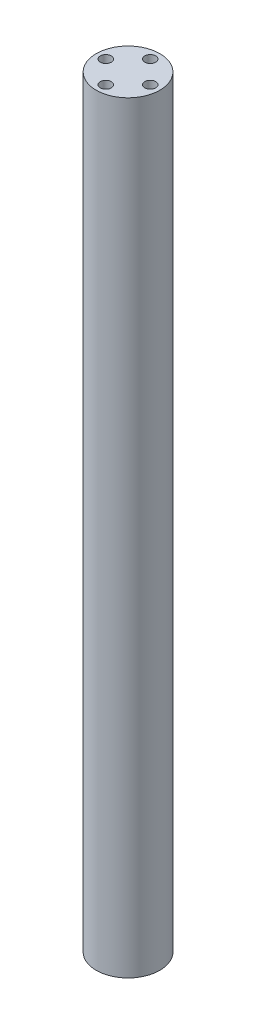
ISO-10303-21;
HEADER;
FILE_DESCRIPTION(('STEP AP214'),'2;1');
FILE_NAME('part.step','',(''),(''),'','','');
FILE_SCHEMA(('AUTOMOTIVE_DESIGN { 1 0 10303 214 1 1 1 1 }'));
ENDSEC;
DATA;
#1=APPLICATION_CONTEXT('core data for automotive mechanical design processes');
#2=APPLICATION_PROTOCOL_DEFINITION('international standard','automotive_design',2000,#1);
#3=PRODUCT_CONTEXT('',#1,'mechanical');
#4=PRODUCT('Part','Part','',(#3));
#5=PRODUCT_RELATED_PRODUCT_CATEGORY('part','',(#4));
#6=PRODUCT_DEFINITION_FORMATION('','',#4);
#7=PRODUCT_DEFINITION_CONTEXT('part definition',#1,'design');
#8=PRODUCT_DEFINITION('design','',#6,#7);
#9=PRODUCT_DEFINITION_SHAPE('','',#8);
#10=(LENGTH_UNIT() NAMED_UNIT(*) SI_UNIT(.MILLI.,.METRE.));
#11=(NAMED_UNIT(*) PLANE_ANGLE_UNIT() SI_UNIT($,.RADIAN.));
#12=(NAMED_UNIT(*) SI_UNIT($,.STERADIAN.) SOLID_ANGLE_UNIT());
#13=UNCERTAINTY_MEASURE_WITH_UNIT(LENGTH_MEASURE(1.E-05),#10,'distance_accuracy_value','');
#14=(GEOMETRIC_REPRESENTATION_CONTEXT(3) GLOBAL_UNCERTAINTY_ASSIGNED_CONTEXT((#13)) GLOBAL_UNIT_ASSIGNED_CONTEXT((#10,
#11,#12)) REPRESENTATION_CONTEXT('',''));
#15=CARTESIAN_POINT('',(0.,0.,0.));
#16=DIRECTION('',(0.,0.,1.));
#17=DIRECTION('',(1.,0.,0.));
#18=AXIS2_PLACEMENT_3D('',#15,#16,#17);
#19=CARTESIAN_POINT('',(0.,304.8,0.));
#20=DIRECTION('',(0.,-1.,0.));
#21=DIRECTION('',(0.,0.,-1.));
#22=AXIS2_PLACEMENT_3D('',#19,#20,#21);
#23=CYLINDRICAL_SURFACE('',#22,12.7);
#24=CARTESIAN_POINT('',(0.,304.8,0.));
#25=DIRECTION('',(0.,1.,0.));
#26=DIRECTION('',(0.,0.,1.));
#27=AXIS2_PLACEMENT_3D('',#24,#25,#26);
#28=CIRCLE('',#27,12.7);
#29=CARTESIAN_POINT('',(0.,304.8,-12.7));
#30=VERTEX_POINT('',#29);
#31=EDGE_CURVE('E10',#30,#30,#28,.T.);
#32=CARTESIAN_POINT('',(0.,0.,0.));
#33=DIRECTION('',(0.,1.,0.));
#34=DIRECTION('',(0.,0.,1.));
#35=AXIS2_PLACEMENT_3D('',#32,#33,#34);
#36=CIRCLE('',#35,12.7);
#37=CARTESIAN_POINT('',(0.,0.,-12.7));
#38=VERTEX_POINT('',#37);
#39=EDGE_CURVE('E40',#38,#38,#36,.T.);
#40=CARTESIAN_POINT('',(0.,304.8,-12.7));
#41=CARTESIAN_POINT('',(0.,301.625,-12.7));
#42=CARTESIAN_POINT('',(0.,298.45,-12.7));
#43=CARTESIAN_POINT('',(0.,292.1,-12.7));
#44=CARTESIAN_POINT('',(0.,288.925,-12.7));
#45=CARTESIAN_POINT('',(0.,282.575,-12.7));
#46=CARTESIAN_POINT('',(0.,279.4,-12.7));
#47=CARTESIAN_POINT('',(0.,273.05,-12.7));
#48=CARTESIAN_POINT('',(0.,269.875,-12.7));
#49=CARTESIAN_POINT('',(0.,263.525,-12.7));
#50=CARTESIAN_POINT('',(0.,260.35,-12.7));
#51=CARTESIAN_POINT('',(0.,254.,-12.7));
#52=CARTESIAN_POINT('',(0.,250.825,-12.7));
#53=CARTESIAN_POINT('',(0.,244.475,-12.7));
#54=CARTESIAN_POINT('',(0.,241.3,-12.7));
#55=CARTESIAN_POINT('',(0.,234.95,-12.7));
#56=CARTESIAN_POINT('',(0.,231.775,-12.7));
#57=CARTESIAN_POINT('',(0.,225.425,-12.7));
#58=CARTESIAN_POINT('',(0.,222.25,-12.7));
#59=CARTESIAN_POINT('',(0.,215.9,-12.7));
#60=CARTESIAN_POINT('',(0.,212.725,-12.7));
#61=CARTESIAN_POINT('',(0.,206.375,-12.7));
#62=CARTESIAN_POINT('',(0.,203.2,-12.7));
#63=CARTESIAN_POINT('',(0.,196.85,-12.7));
#64=CARTESIAN_POINT('',(0.,193.675,-12.7));
#65=CARTESIAN_POINT('',(0.,187.325,-12.7));
#66=CARTESIAN_POINT('',(0.,184.15,-12.7));
#67=CARTESIAN_POINT('',(0.,177.8,-12.7));
#68=CARTESIAN_POINT('',(0.,174.625,-12.7));
#69=CARTESIAN_POINT('',(0.,168.275,-12.7));
#70=CARTESIAN_POINT('',(0.,165.1,-12.7));
#71=CARTESIAN_POINT('',(0.,158.75,-12.7));
#72=CARTESIAN_POINT('',(0.,155.575,-12.7));
#73=CARTESIAN_POINT('',(0.,149.225,-12.7));
#74=CARTESIAN_POINT('',(0.,146.05,-12.7));
#75=CARTESIAN_POINT('',(0.,139.7,-12.7));
#76=CARTESIAN_POINT('',(0.,136.525,-12.7));
#77=CARTESIAN_POINT('',(0.,130.175,-12.7));
#78=CARTESIAN_POINT('',(0.,127.,-12.7));
#79=CARTESIAN_POINT('',(0.,120.65,-12.7));
#80=CARTESIAN_POINT('',(0.,117.475,-12.7));
#81=CARTESIAN_POINT('',(0.,111.125,-12.7));
#82=CARTESIAN_POINT('',(0.,107.95,-12.7));
#83=CARTESIAN_POINT('',(0.,101.6,-12.7));
#84=CARTESIAN_POINT('',(0.,98.425,-12.7));
#85=CARTESIAN_POINT('',(0.,92.075,-12.7));
#86=CARTESIAN_POINT('',(0.,88.9,-12.7));
#87=CARTESIAN_POINT('',(0.,82.55,-12.7));
#88=CARTESIAN_POINT('',(0.,79.375,-12.7));
#89=CARTESIAN_POINT('',(0.,73.025,-12.7));
#90=CARTESIAN_POINT('',(0.,69.85,-12.7));
#91=CARTESIAN_POINT('',(0.,63.5,-12.7));
#92=CARTESIAN_POINT('',(0.,60.325,-12.7));
#93=CARTESIAN_POINT('',(0.,53.975,-12.7));
#94=CARTESIAN_POINT('',(0.,50.8,-12.7));
#95=CARTESIAN_POINT('',(0.,44.45,-12.7));
#96=CARTESIAN_POINT('',(0.,41.275,-12.7));
#97=CARTESIAN_POINT('',(0.,34.925,-12.7));
#98=CARTESIAN_POINT('',(0.,31.75,-12.7));
#99=CARTESIAN_POINT('',(0.,25.4,-12.7));
#100=CARTESIAN_POINT('',(0.,22.225,-12.7));
#101=CARTESIAN_POINT('',(0.,15.875,-12.7));
#102=CARTESIAN_POINT('',(0.,12.7,-12.7));
#103=CARTESIAN_POINT('',(0.,6.35,-12.7));
#104=CARTESIAN_POINT('',(0.,3.175,-12.7));
#105=CARTESIAN_POINT('',(0.,0.,-12.7));
#106=B_SPLINE_CURVE_WITH_KNOTS('',3,(#40,#41,#42,#43,#44,#45,#46,#47,#48,#49,#50,#51,#52,#53,
#54,#55,#56,#57,#58,#59,#60,#61,#62,#63,#64,#65,#66,#67,#68,#69,#70,#71,#72,#73,#74,#75,#76,#77,
#78,#79,#80,#81,#82,#83,#84,#85,#86,#87,#88,#89,#90,#91,#92,#93,#94,#95,#96,#97,#98,#99,#100,
#101,#102,#103,#104,#105),.UNSPECIFIED.,.F.,.F.,(4,2,2,2,2,2,2,2,2,2,2,2,2,2,2,2,2,2,2,2,2,2,2,
2,2,2,2,2,2,2,2,2,4),(0.,9.52500000000001,19.05,28.575,38.1,47.625,57.15,66.675,76.2,
85.7250000000001,95.2500000000001,104.775,114.3,123.825,133.35,142.875,152.4,161.925,171.45,
180.975,190.5,200.025,209.55,219.075,228.6,238.125,247.65,257.175,266.7,276.225,285.75,295.275,
304.8),.UNSPECIFIED.);
#107=EDGE_CURVE('BSEAM37',#30,#38,#106,.T.);
#108=ORIENTED_EDGE('',*,*,#31,.F.);
#109=ORIENTED_EDGE('',*,*,#39,.T.);
#110=ORIENTED_EDGE('',*,*,#107,.T.);
#111=ORIENTED_EDGE('',*,*,#107,.F.);
#112=EDGE_LOOP('',(#108,#110,#109,#111));
#113=FACE_BOUND('',#112,.T.);
#114=ADVANCED_FACE('F37',(#113),#23,.T.);
#115=CARTESIAN_POINT('',(0.,304.8,0.));
#116=DIRECTION('',(0.,1.,0.));
#117=DIRECTION('',(0.,0.,1.));
#118=AXIS2_PLACEMENT_3D('',#115,#116,#117);
#119=PLANE('',#118);
#120=CARTESIAN_POINT('',(8.89,304.8,0.));
#121=DIRECTION('',(0.,1.,0.));
#122=DIRECTION('',(0.,0.,1.));
#123=AXIS2_PLACEMENT_3D('',#120,#121,#122);
#124=CIRCLE('',#123,2.1971);
#125=CARTESIAN_POINT('',(8.89,304.8,2.1971));
#126=VERTEX_POINT('',#125);
#127=EDGE_CURVE('E83',#126,#126,#124,.T.);
#128=ORIENTED_EDGE('',*,*,#127,.F.);
#129=EDGE_LOOP('',(#128));
#130=FACE_BOUND('',#129,.T.);
#131=CARTESIAN_POINT('',(0.,304.8,8.89));
#132=DIRECTION('',(0.,1.,0.));
#133=DIRECTION('',(0.,0.,1.));
#134=AXIS2_PLACEMENT_3D('',#131,#132,#133);
#135=CIRCLE('',#134,2.1971);
#136=CARTESIAN_POINT('',(0.,304.8,11.0871));
#137=VERTEX_POINT('',#136);
#138=EDGE_CURVE('E79',#137,#137,#135,.T.);
#139=ORIENTED_EDGE('',*,*,#138,.F.);
#140=EDGE_LOOP('',(#139));
#141=FACE_BOUND('',#140,.T.);
#142=CARTESIAN_POINT('',(-8.89,304.8,0.));
#143=DIRECTION('',(0.,1.,0.));
#144=DIRECTION('',(0.,0.,1.));
#145=AXIS2_PLACEMENT_3D('',#142,#143,#144);
#146=CIRCLE('',#145,2.1971);
#147=CARTESIAN_POINT('',(-8.89,304.8,2.1971));
#148=VERTEX_POINT('',#147);
#149=EDGE_CURVE('E71',#148,#148,#146,.T.);
#150=ORIENTED_EDGE('',*,*,#149,.F.);
#151=EDGE_LOOP('',(#150));
#152=FACE_BOUND('',#151,.T.);
#153=CARTESIAN_POINT('',(0.,304.8,-8.89));
#154=DIRECTION('',(0.,1.,0.));
#155=DIRECTION('',(0.,0.,1.));
#156=AXIS2_PLACEMENT_3D('',#153,#154,#155);
#157=CIRCLE('',#156,2.1971);
#158=CARTESIAN_POINT('',(0.,304.8,-6.6929));
#159=VERTEX_POINT('',#158);
#160=EDGE_CURVE('E63',#159,#159,#157,.T.);
#161=ORIENTED_EDGE('',*,*,#160,.F.);
#162=EDGE_LOOP('',(#161));
#163=FACE_BOUND('',#162,.T.);
#164=ORIENTED_EDGE('',*,*,#31,.T.);
#165=EDGE_LOOP('',(#164));
#166=FACE_BOUND('',#165,.T.);
#167=ADVANCED_FACE('F100',(#130,#141,#152,#163,#166),#119,.T.);
#168=CARTESIAN_POINT('',(0.,0.,0.));
#169=DIRECTION('',(0.,1.,0.));
#170=DIRECTION('',(0.,0.,1.));
#171=AXIS2_PLACEMENT_3D('',#168,#169,#170);
#172=PLANE('',#171);
#173=CARTESIAN_POINT('',(0.,0.,0.));
#174=DIRECTION('',(0.,-1.,0.));
#175=DIRECTION('',(0.,0.,-1.));
#176=AXIS2_PLACEMENT_3D('',#173,#174,#175);
#177=CIRCLE('',#176,3.96875);
#178=CARTESIAN_POINT('',(0.,0.,-3.96875));
#179=VERTEX_POINT('',#178);
#180=EDGE_CURVE('E51',#179,#179,#177,.T.);
#181=ORIENTED_EDGE('',*,*,#180,.F.);
#182=EDGE_LOOP('',(#181));
#183=FACE_BOUND('',#182,.T.);
#184=ORIENTED_EDGE('',*,*,#39,.F.);
#185=EDGE_LOOP('',(#184));
#186=FACE_BOUND('',#185,.T.);
#187=ADVANCED_FACE('F103',(#183,#186),#172,.F.);
#188=CARTESIAN_POINT('',(0.,76.2,0.));
#189=DIRECTION('',(0.,-1.,0.));
#190=DIRECTION('',(0.,0.,-1.));
#191=AXIS2_PLACEMENT_3D('',#188,#189,#190);
#192=CYLINDRICAL_SURFACE('',#191,3.96875);
#193=CARTESIAN_POINT('',(0.,76.2,0.));
#194=DIRECTION('',(0.,-1.,0.));
#195=DIRECTION('',(0.,0.,-1.));
#196=AXIS2_PLACEMENT_3D('',#193,#194,#195);
#197=CIRCLE('',#196,3.96875);
#198=CARTESIAN_POINT('',(0.,76.2,-3.96875));
#199=VERTEX_POINT('',#198);
#200=EDGE_CURVE('E49',#199,#199,#197,.T.);
#201=CARTESIAN_POINT('',(0.,76.2,-3.96875));
#202=CARTESIAN_POINT('',(0.,75.40625,-3.96875));
#203=CARTESIAN_POINT('',(0.,74.6125,-3.96875));
#204=CARTESIAN_POINT('',(0.,73.025,-3.96875));
#205=CARTESIAN_POINT('',(0.,72.23125,-3.96875));
#206=CARTESIAN_POINT('',(0.,70.64375,-3.96875));
#207=CARTESIAN_POINT('',(0.,69.85,-3.96875));
#208=CARTESIAN_POINT('',(0.,68.2625,-3.96875));
#209=CARTESIAN_POINT('',(0.,67.46875,-3.96875));
#210=CARTESIAN_POINT('',(0.,65.88125,-3.96875));
#211=CARTESIAN_POINT('',(0.,65.0875,-3.96875));
#212=CARTESIAN_POINT('',(0.,63.5,-3.96875));
#213=CARTESIAN_POINT('',(0.,62.70625,-3.96875));
#214=CARTESIAN_POINT('',(0.,61.11875,-3.96875));
#215=CARTESIAN_POINT('',(0.,60.325,-3.96875));
#216=CARTESIAN_POINT('',(0.,58.7375,-3.96875));
#217=CARTESIAN_POINT('',(0.,57.94375,-3.96875));
#218=CARTESIAN_POINT('',(0.,56.35625,-3.96875));
#219=CARTESIAN_POINT('',(0.,55.5625,-3.96875));
#220=CARTESIAN_POINT('',(0.,53.975,-3.96875));
#221=CARTESIAN_POINT('',(0.,53.18125,-3.96875));
#222=CARTESIAN_POINT('',(0.,51.59375,-3.96875));
#223=CARTESIAN_POINT('',(0.,50.8,-3.96875));
#224=CARTESIAN_POINT('',(0.,49.2125,-3.96875));
#225=CARTESIAN_POINT('',(0.,48.41875,-3.96875));
#226=CARTESIAN_POINT('',(0.,46.83125,-3.96875));
#227=CARTESIAN_POINT('',(0.,46.0375,-3.96875));
#228=CARTESIAN_POINT('',(0.,44.45,-3.96875));
#229=CARTESIAN_POINT('',(0.,43.65625,-3.96875));
#230=CARTESIAN_POINT('',(0.,42.06875,-3.96875));
#231=CARTESIAN_POINT('',(0.,41.275,-3.96875));
#232=CARTESIAN_POINT('',(0.,39.6875,-3.96875));
#233=CARTESIAN_POINT('',(0.,38.89375,-3.96875));
#234=CARTESIAN_POINT('',(0.,37.30625,-3.96875));
#235=CARTESIAN_POINT('',(0.,36.5125,-3.96875));
#236=CARTESIAN_POINT('',(0.,34.925,-3.96875));
#237=CARTESIAN_POINT('',(0.,34.13125,-3.96875));
#238=CARTESIAN_POINT('',(0.,32.54375,-3.96875));
#239=CARTESIAN_POINT('',(0.,31.75,-3.96875));
#240=CARTESIAN_POINT('',(0.,30.1625,-3.96875));
#241=CARTESIAN_POINT('',(0.,29.36875,-3.96875));
#242=CARTESIAN_POINT('',(0.,27.78125,-3.96875));
#243=CARTESIAN_POINT('',(0.,26.9875,-3.96875));
#244=CARTESIAN_POINT('',(0.,25.4,-3.96875));
#245=CARTESIAN_POINT('',(0.,24.60625,-3.96875));
#246=CARTESIAN_POINT('',(0.,23.01875,-3.96875));
#247=CARTESIAN_POINT('',(0.,22.225,-3.96875));
#248=CARTESIAN_POINT('',(0.,20.6375,-3.96875));
#249=CARTESIAN_POINT('',(0.,19.84375,-3.96875));
#250=CARTESIAN_POINT('',(0.,18.25625,-3.96875));
#251=CARTESIAN_POINT('',(0.,17.4625,-3.96875));
#252=CARTESIAN_POINT('',(0.,15.875,-3.96875));
#253=CARTESIAN_POINT('',(0.,15.08125,-3.96875));
#254=CARTESIAN_POINT('',(0.,13.49375,-3.96875));
#255=CARTESIAN_POINT('',(0.,12.7,-3.96875));
#256=CARTESIAN_POINT('',(0.,11.1125,-3.96875));
#257=CARTESIAN_POINT('',(0.,10.31875,-3.96875));
#258=CARTESIAN_POINT('',(0.,8.73125,-3.96875));
#259=CARTESIAN_POINT('',(0.,7.93750000000001,-3.96875));
#260=CARTESIAN_POINT('',(0.,6.35,-3.96875));
#261=CARTESIAN_POINT('',(0.,5.55625,-3.96875));
#262=CARTESIAN_POINT('',(0.,3.96875,-3.96875));
#263=CARTESIAN_POINT('',(0.,3.175,-3.96875));
#264=CARTESIAN_POINT('',(0.,1.5875,-3.96875));
#265=CARTESIAN_POINT('',(0.,0.793750000000001,-3.96875));
#266=CARTESIAN_POINT('',(0.,0.,-3.96875));
#267=B_SPLINE_CURVE_WITH_KNOTS('',3,(#201,#202,#203,#204,#205,#206,#207,#208,#209,#210,#211,
#212,#213,#214,#215,#216,#217,#218,#219,#220,#221,#222,#223,#224,#225,#226,#227,#228,#229,#230,
#231,#232,#233,#234,#235,#236,#237,#238,#239,#240,#241,#242,#243,#244,#245,#246,#247,#248,#249,
#250,#251,#252,#253,#254,#255,#256,#257,#258,#259,#260,#261,#262,#263,#264,#265,#266),
.UNSPECIFIED.,.F.,.F.,(4,2,2,2,2,2,2,2,2,2,2,2,2,2,2,2,2,2,2,2,2,2,2,2,2,2,2,2,2,2,2,2,4),(0.,
2.38125,4.7625,7.14375,9.52500000000001,11.90625,14.2875,16.66875,19.05,21.43125,23.8125,
26.19375,28.575,30.95625,33.3375,35.71875,38.1,40.48125,42.8625,45.24375,47.625,50.00625,
52.3875,54.76875,57.15,59.53125,61.9125,64.29375,66.675,69.05625,71.4375,73.81875,76.2),.UNSPECIFIED.);
#268=EDGE_CURVE('BSEAM124',#199,#179,#267,.T.);
#269=ORIENTED_EDGE('',*,*,#200,.F.);
#270=ORIENTED_EDGE('',*,*,#180,.T.);
#271=ORIENTED_EDGE('',*,*,#268,.T.);
#272=ORIENTED_EDGE('',*,*,#268,.F.);
#273=EDGE_LOOP('',(#269,#271,#270,#272));
#274=FACE_BOUND('',#273,.T.);
#275=ADVANCED_FACE('F124',(#274),#192,.F.);
#276=CARTESIAN_POINT('',(0.,76.2,0.));
#277=DIRECTION('',(0.,-1.,0.));
#278=DIRECTION('',(0.,0.,-1.));
#279=AXIS2_PLACEMENT_3D('',#276,#277,#278);
#280=PLANE('',#279);
#281=ORIENTED_EDGE('',*,*,#200,.T.);
#282=EDGE_LOOP('',(#281));
#283=FACE_BOUND('',#282,.T.);
#284=ADVANCED_FACE('F114',(#283),#280,.T.);
#285=CARTESIAN_POINT('',(0.,228.6,-8.89));
#286=DIRECTION('',(0.,1.,0.));
#287=DIRECTION('',(0.,0.,1.));
#288=AXIS2_PLACEMENT_3D('',#285,#286,#287);
#289=CYLINDRICAL_SURFACE('',#288,2.1971);
#290=CARTESIAN_POINT('',(0.,228.6,-8.89));
#291=DIRECTION('',(0.,1.,0.));
#292=DIRECTION('',(0.,0.,1.));
#293=AXIS2_PLACEMENT_3D('',#290,#291,#292);
#294=CIRCLE('',#293,2.1971);
#295=CARTESIAN_POINT('',(0.,228.6,-6.6929));
#296=VERTEX_POINT('',#295);
#297=EDGE_CURVE('E59',#296,#296,#294,.T.);
#298=CARTESIAN_POINT('',(0.,228.6,-6.6929));
#299=CARTESIAN_POINT('',(0.,229.39375,-6.6929));
#300=CARTESIAN_POINT('',(0.,230.1875,-6.6929));
#301=CARTESIAN_POINT('',(0.,231.775,-6.6929));
#302=CARTESIAN_POINT('',(0.,232.56875,-6.6929));
#303=CARTESIAN_POINT('',(0.,234.15625,-6.6929));
#304=CARTESIAN_POINT('',(0.,234.95,-6.6929));
#305=CARTESIAN_POINT('',(0.,236.5375,-6.6929));
#306=CARTESIAN_POINT('',(0.,237.33125,-6.6929));
#307=CARTESIAN_POINT('',(0.,238.91875,-6.6929));
#308=CARTESIAN_POINT('',(0.,239.7125,-6.6929));
#309=CARTESIAN_POINT('',(0.,241.3,-6.6929));
#310=CARTESIAN_POINT('',(0.,242.09375,-6.6929));
#311=CARTESIAN_POINT('',(0.,243.68125,-6.6929));
#312=CARTESIAN_POINT('',(0.,244.475,-6.6929));
#313=CARTESIAN_POINT('',(0.,246.0625,-6.6929));
#314=CARTESIAN_POINT('',(0.,246.85625,-6.6929));
#315=CARTESIAN_POINT('',(0.,248.44375,-6.6929));
#316=CARTESIAN_POINT('',(0.,249.2375,-6.6929));
#317=CARTESIAN_POINT('',(0.,250.825,-6.6929));
#318=CARTESIAN_POINT('',(0.,251.61875,-6.6929));
#319=CARTESIAN_POINT('',(0.,253.20625,-6.6929));
#320=CARTESIAN_POINT('',(0.,254.,-6.6929));
#321=CARTESIAN_POINT('',(0.,255.5875,-6.6929));
#322=CARTESIAN_POINT('',(0.,256.38125,-6.6929));
#323=CARTESIAN_POINT('',(0.,257.96875,-6.6929));
#324=CARTESIAN_POINT('',(0.,258.7625,-6.6929));
#325=CARTESIAN_POINT('',(0.,260.35,-6.6929));
#326=CARTESIAN_POINT('',(0.,261.14375,-6.6929));
#327=CARTESIAN_POINT('',(0.,262.73125,-6.6929));
#328=CARTESIAN_POINT('',(0.,263.525,-6.6929));
#329=CARTESIAN_POINT('',(0.,265.1125,-6.6929));
#330=CARTESIAN_POINT('',(0.,265.90625,-6.6929));
#331=CARTESIAN_POINT('',(0.,267.49375,-6.6929));
#332=CARTESIAN_POINT('',(0.,268.2875,-6.6929));
#333=CARTESIAN_POINT('',(0.,269.875,-6.6929));
#334=CARTESIAN_POINT('',(0.,270.66875,-6.6929));
#335=CARTESIAN_POINT('',(0.,272.25625,-6.6929));
#336=CARTESIAN_POINT('',(0.,273.05,-6.6929));
#337=CARTESIAN_POINT('',(0.,274.6375,-6.6929));
#338=CARTESIAN_POINT('',(0.,275.43125,-6.6929));
#339=CARTESIAN_POINT('',(0.,277.01875,-6.6929));
#340=CARTESIAN_POINT('',(0.,277.8125,-6.6929));
#341=CARTESIAN_POINT('',(0.,279.4,-6.6929));
#342=CARTESIAN_POINT('',(0.,280.19375,-6.6929));
#343=CARTESIAN_POINT('',(0.,281.78125,-6.6929));
#344=CARTESIAN_POINT('',(0.,282.575,-6.6929));
#345=CARTESIAN_POINT('',(0.,284.1625,-6.6929));
#346=CARTESIAN_POINT('',(0.,284.95625,-6.6929));
#347=CARTESIAN_POINT('',(0.,286.54375,-6.6929));
#348=CARTESIAN_POINT('',(0.,287.3375,-6.6929));
#349=CARTESIAN_POINT('',(0.,288.925,-6.6929));
#350=CARTESIAN_POINT('',(0.,289.71875,-6.6929));
#351=CARTESIAN_POINT('',(0.,291.30625,-6.6929));
#352=CARTESIAN_POINT('',(0.,292.1,-6.6929));
#353=CARTESIAN_POINT('',(0.,293.6875,-6.6929));
#354=CARTESIAN_POINT('',(0.,294.48125,-6.6929));
#355=CARTESIAN_POINT('',(0.,296.06875,-6.6929));
#356=CARTESIAN_POINT('',(0.,296.8625,-6.6929));
#357=CARTESIAN_POINT('',(0.,298.45,-6.6929));
#358=CARTESIAN_POINT('',(0.,299.24375,-6.6929));
#359=CARTESIAN_POINT('',(0.,300.83125,-6.6929));
#360=CARTESIAN_POINT('',(0.,301.625,-6.6929));
#361=CARTESIAN_POINT('',(0.,303.2125,-6.6929));
#362=CARTESIAN_POINT('',(0.,304.00625,-6.6929));
#363=CARTESIAN_POINT('',(0.,304.8,-6.6929));
#364=B_SPLINE_CURVE_WITH_KNOTS('',3,(#298,#299,#300,#301,#302,#303,#304,#305,#306,#307,#308,
#309,#310,#311,#312,#313,#314,#315,#316,#317,#318,#319,#320,#321,#322,#323,#324,#325,#326,#327,
#328,#329,#330,#331,#332,#333,#334,#335,#336,#337,#338,#339,#340,#341,#342,#343,#344,#345,#346,
#347,#348,#349,#350,#351,#352,#353,#354,#355,#356,#357,#358,#359,#360,#361,#362,#363),
.UNSPECIFIED.,.F.,.F.,(4,2,2,2,2,2,2,2,2,2,2,2,2,2,2,2,2,2,2,2,2,2,2,2,2,2,2,2,2,2,2,2,4),(0.,
2.38125,4.7625,7.14375,9.52500000000001,11.90625,14.2875,16.66875,19.05,21.43125,23.8125,
26.19375,28.575,30.95625,33.3375,35.71875,38.1,40.48125,42.8625,45.24375,47.625,50.00625,
52.3875,54.76875,57.15,59.53125,61.9125,64.29375,66.675,69.05625,71.4375,73.81875,76.2),.UNSPECIFIED.);
#365=EDGE_CURVE('BSEAM111',#296,#159,#364,.T.);
#366=ORIENTED_EDGE('',*,*,#297,.F.);
#367=ORIENTED_EDGE('',*,*,#160,.T.);
#368=ORIENTED_EDGE('',*,*,#365,.T.);
#369=ORIENTED_EDGE('',*,*,#365,.F.);
#370=EDGE_LOOP('',(#366,#368,#367,#369));
#371=FACE_BOUND('',#370,.T.);
#372=ADVANCED_FACE('F111',(#371),#289,.F.);
#373=CARTESIAN_POINT('',(0.,228.6,-8.89));
#374=DIRECTION('',(0.,1.,0.));
#375=DIRECTION('',(0.,0.,1.));
#376=AXIS2_PLACEMENT_3D('',#373,#374,#375);
#377=PLANE('',#376);
#378=ORIENTED_EDGE('',*,*,#297,.T.);
#379=EDGE_LOOP('',(#378));
#380=FACE_BOUND('',#379,.T.);
#381=ADVANCED_FACE('F113',(#380),#377,.T.);
#382=CARTESIAN_POINT('',(-8.89,228.6,0.));
#383=DIRECTION('',(0.,1.,0.));
#384=DIRECTION('',(0.,0.,1.));
#385=AXIS2_PLACEMENT_3D('',#382,#383,#384);
#386=CYLINDRICAL_SURFACE('',#385,2.1971);
#387=CARTESIAN_POINT('',(-8.89,228.6,0.));
#388=DIRECTION('',(0.,1.,0.));
#389=DIRECTION('',(0.,0.,1.));
#390=AXIS2_PLACEMENT_3D('',#387,#388,#389);
#391=CIRCLE('',#390,2.1971);
#392=CARTESIAN_POINT('',(-8.89,228.6,2.1971));
#393=VERTEX_POINT('',#392);
#394=EDGE_CURVE('E67',#393,#393,#391,.T.);
#395=CARTESIAN_POINT('',(-8.89,228.6,2.1971));
#396=CARTESIAN_POINT('',(-8.89,229.39375,2.1971));
#397=CARTESIAN_POINT('',(-8.89,230.1875,2.1971));
#398=CARTESIAN_POINT('',(-8.89,231.775,2.1971));
#399=CARTESIAN_POINT('',(-8.89,232.56875,2.1971));
#400=CARTESIAN_POINT('',(-8.89,234.15625,2.1971));
#401=CARTESIAN_POINT('',(-8.89,234.95,2.1971));
#402=CARTESIAN_POINT('',(-8.89,236.5375,2.1971));
#403=CARTESIAN_POINT('',(-8.89,237.33125,2.1971));
#404=CARTESIAN_POINT('',(-8.89,238.91875,2.1971));
#405=CARTESIAN_POINT('',(-8.89,239.7125,2.1971));
#406=CARTESIAN_POINT('',(-8.89,241.3,2.1971));
#407=CARTESIAN_POINT('',(-8.89,242.09375,2.1971));
#408=CARTESIAN_POINT('',(-8.89,243.68125,2.1971));
#409=CARTESIAN_POINT('',(-8.89,244.475,2.1971));
#410=CARTESIAN_POINT('',(-8.89,246.0625,2.1971));
#411=CARTESIAN_POINT('',(-8.89,246.85625,2.1971));
#412=CARTESIAN_POINT('',(-8.89,248.44375,2.1971));
#413=CARTESIAN_POINT('',(-8.89,249.2375,2.1971));
#414=CARTESIAN_POINT('',(-8.89,250.825,2.1971));
#415=CARTESIAN_POINT('',(-8.89,251.61875,2.1971));
#416=CARTESIAN_POINT('',(-8.89,253.20625,2.1971));
#417=CARTESIAN_POINT('',(-8.89,254.,2.1971));
#418=CARTESIAN_POINT('',(-8.89,255.5875,2.1971));
#419=CARTESIAN_POINT('',(-8.89,256.38125,2.1971));
#420=CARTESIAN_POINT('',(-8.89,257.96875,2.1971));
#421=CARTESIAN_POINT('',(-8.89,258.7625,2.1971));
#422=CARTESIAN_POINT('',(-8.89,260.35,2.1971));
#423=CARTESIAN_POINT('',(-8.89,261.14375,2.1971));
#424=CARTESIAN_POINT('',(-8.89,262.73125,2.1971));
#425=CARTESIAN_POINT('',(-8.89,263.525,2.1971));
#426=CARTESIAN_POINT('',(-8.89,265.1125,2.1971));
#427=CARTESIAN_POINT('',(-8.89,265.90625,2.1971));
#428=CARTESIAN_POINT('',(-8.89,267.49375,2.1971));
#429=CARTESIAN_POINT('',(-8.89,268.2875,2.1971));
#430=CARTESIAN_POINT('',(-8.89,269.875,2.1971));
#431=CARTESIAN_POINT('',(-8.89,270.66875,2.1971));
#432=CARTESIAN_POINT('',(-8.89,272.25625,2.1971));
#433=CARTESIAN_POINT('',(-8.89,273.05,2.1971));
#434=CARTESIAN_POINT('',(-8.89,274.6375,2.1971));
#435=CARTESIAN_POINT('',(-8.89,275.43125,2.1971));
#436=CARTESIAN_POINT('',(-8.89,277.01875,2.1971));
#437=CARTESIAN_POINT('',(-8.89,277.8125,2.1971));
#438=CARTESIAN_POINT('',(-8.89,279.4,2.1971));
#439=CARTESIAN_POINT('',(-8.89,280.19375,2.1971));
#440=CARTESIAN_POINT('',(-8.89,281.78125,2.1971));
#441=CARTESIAN_POINT('',(-8.89,282.575,2.1971));
#442=CARTESIAN_POINT('',(-8.89,284.1625,2.1971));
#443=CARTESIAN_POINT('',(-8.89,284.95625,2.1971));
#444=CARTESIAN_POINT('',(-8.89,286.54375,2.1971));
#445=CARTESIAN_POINT('',(-8.89,287.3375,2.1971));
#446=CARTESIAN_POINT('',(-8.89,288.925,2.1971));
#447=CARTESIAN_POINT('',(-8.89,289.71875,2.1971));
#448=CARTESIAN_POINT('',(-8.89,291.30625,2.1971));
#449=CARTESIAN_POINT('',(-8.89,292.1,2.1971));
#450=CARTESIAN_POINT('',(-8.89,293.6875,2.1971));
#451=CARTESIAN_POINT('',(-8.89,294.48125,2.1971));
#452=CARTESIAN_POINT('',(-8.89,296.06875,2.1971));
#453=CARTESIAN_POINT('',(-8.89,296.8625,2.1971));
#454=CARTESIAN_POINT('',(-8.89,298.45,2.1971));
#455=CARTESIAN_POINT('',(-8.89,299.24375,2.1971));
#456=CARTESIAN_POINT('',(-8.89,300.83125,2.1971));
#457=CARTESIAN_POINT('',(-8.89,301.625,2.1971));
#458=CARTESIAN_POINT('',(-8.89,303.2125,2.1971));
#459=CARTESIAN_POINT('',(-8.89,304.00625,2.1971));
#460=CARTESIAN_POINT('',(-8.89,304.8,2.1971));
#461=B_SPLINE_CURVE_WITH_KNOTS('',3,(#395,#396,#397,#398,#399,#400,#401,#402,#403,#404,#405,
#406,#407,#408,#409,#410,#411,#412,#413,#414,#415,#416,#417,#418,#419,#420,#421,#422,#423,#424,
#425,#426,#427,#428,#429,#430,#431,#432,#433,#434,#435,#436,#437,#438,#439,#440,#441,#442,#443,
#444,#445,#446,#447,#448,#449,#450,#451,#452,#453,#454,#455,#456,#457,#458,#459,#460),
.UNSPECIFIED.,.F.,.F.,(4,2,2,2,2,2,2,2,2,2,2,2,2,2,2,2,2,2,2,2,2,2,2,2,2,2,2,2,2,2,2,2,4),(0.,
2.38125,4.7625,7.14375,9.52500000000001,11.90625,14.2875,16.66875,19.05,21.43125,23.8125,
26.19375,28.575,30.95625,33.3375,35.71875,38.1,40.48125,42.8625,45.24375,47.625,50.00625,
52.3875,54.76875,57.15,59.53125,61.9125,64.29375,66.675,69.05625,71.4375,73.81875,76.2),.UNSPECIFIED.);
#462=EDGE_CURVE('BSEAM121',#393,#148,#461,.T.);
#463=ORIENTED_EDGE('',*,*,#394,.F.);
#464=ORIENTED_EDGE('',*,*,#149,.T.);
#465=ORIENTED_EDGE('',*,*,#462,.T.);
#466=ORIENTED_EDGE('',*,*,#462,.F.);
#467=EDGE_LOOP('',(#463,#465,#464,#466));
#468=FACE_BOUND('',#467,.T.);
#469=ADVANCED_FACE('F121',(#468),#386,.F.);
#470=CARTESIAN_POINT('',(-8.89,228.6,0.));
#471=DIRECTION('',(0.,1.,0.));
#472=DIRECTION('',(0.,0.,1.));
#473=AXIS2_PLACEMENT_3D('',#470,#471,#472);
#474=PLANE('',#473);
#475=ORIENTED_EDGE('',*,*,#394,.T.);
#476=EDGE_LOOP('',(#475));
#477=FACE_BOUND('',#476,.T.);
#478=ADVANCED_FACE('F179',(#477),#474,.T.);
#479=CARTESIAN_POINT('',(0.,228.6,8.89));
#480=DIRECTION('',(0.,1.,0.));
#481=DIRECTION('',(0.,0.,1.));
#482=AXIS2_PLACEMENT_3D('',#479,#480,#481);
#483=CYLINDRICAL_SURFACE('',#482,2.1971);
#484=CARTESIAN_POINT('',(0.,228.6,8.89));
#485=DIRECTION('',(0.,1.,0.));
#486=DIRECTION('',(0.,0.,1.));
#487=AXIS2_PLACEMENT_3D('',#484,#485,#486);
#488=CIRCLE('',#487,2.1971);
#489=CARTESIAN_POINT('',(0.,228.6,11.0871));
#490=VERTEX_POINT('',#489);
#491=EDGE_CURVE('E75',#490,#490,#488,.T.);
#492=CARTESIAN_POINT('',(0.,228.6,11.0871));
#493=CARTESIAN_POINT('',(0.,229.39375,11.0871));
#494=CARTESIAN_POINT('',(0.,230.1875,11.0871));
#495=CARTESIAN_POINT('',(0.,231.775,11.0871));
#496=CARTESIAN_POINT('',(0.,232.56875,11.0871));
#497=CARTESIAN_POINT('',(0.,234.15625,11.0871));
#498=CARTESIAN_POINT('',(0.,234.95,11.0871));
#499=CARTESIAN_POINT('',(0.,236.5375,11.0871));
#500=CARTESIAN_POINT('',(0.,237.33125,11.0871));
#501=CARTESIAN_POINT('',(0.,238.91875,11.0871));
#502=CARTESIAN_POINT('',(0.,239.7125,11.0871));
#503=CARTESIAN_POINT('',(0.,241.3,11.0871));
#504=CARTESIAN_POINT('',(0.,242.09375,11.0871));
#505=CARTESIAN_POINT('',(0.,243.68125,11.0871));
#506=CARTESIAN_POINT('',(0.,244.475,11.0871));
#507=CARTESIAN_POINT('',(0.,246.0625,11.0871));
#508=CARTESIAN_POINT('',(0.,246.85625,11.0871));
#509=CARTESIAN_POINT('',(0.,248.44375,11.0871));
#510=CARTESIAN_POINT('',(0.,249.2375,11.0871));
#511=CARTESIAN_POINT('',(0.,250.825,11.0871));
#512=CARTESIAN_POINT('',(0.,251.61875,11.0871));
#513=CARTESIAN_POINT('',(0.,253.20625,11.0871));
#514=CARTESIAN_POINT('',(0.,254.,11.0871));
#515=CARTESIAN_POINT('',(0.,255.5875,11.0871));
#516=CARTESIAN_POINT('',(0.,256.38125,11.0871));
#517=CARTESIAN_POINT('',(0.,257.96875,11.0871));
#518=CARTESIAN_POINT('',(0.,258.7625,11.0871));
#519=CARTESIAN_POINT('',(0.,260.35,11.0871));
#520=CARTESIAN_POINT('',(0.,261.14375,11.0871));
#521=CARTESIAN_POINT('',(0.,262.73125,11.0871));
#522=CARTESIAN_POINT('',(0.,263.525,11.0871));
#523=CARTESIAN_POINT('',(0.,265.1125,11.0871));
#524=CARTESIAN_POINT('',(0.,265.90625,11.0871));
#525=CARTESIAN_POINT('',(0.,267.49375,11.0871));
#526=CARTESIAN_POINT('',(0.,268.2875,11.0871));
#527=CARTESIAN_POINT('',(0.,269.875,11.0871));
#528=CARTESIAN_POINT('',(0.,270.66875,11.0871));
#529=CARTESIAN_POINT('',(0.,272.25625,11.0871));
#530=CARTESIAN_POINT('',(0.,273.05,11.0871));
#531=CARTESIAN_POINT('',(0.,274.6375,11.0871));
#532=CARTESIAN_POINT('',(0.,275.43125,11.0871));
#533=CARTESIAN_POINT('',(0.,277.01875,11.0871));
#534=CARTESIAN_POINT('',(0.,277.8125,11.0871));
#535=CARTESIAN_POINT('',(0.,279.4,11.0871));
#536=CARTESIAN_POINT('',(0.,280.19375,11.0871));
#537=CARTESIAN_POINT('',(0.,281.78125,11.0871));
#538=CARTESIAN_POINT('',(0.,282.575,11.0871));
#539=CARTESIAN_POINT('',(0.,284.1625,11.0871));
#540=CARTESIAN_POINT('',(0.,284.95625,11.0871));
#541=CARTESIAN_POINT('',(0.,286.54375,11.0871));
#542=CARTESIAN_POINT('',(0.,287.3375,11.0871));
#543=CARTESIAN_POINT('',(0.,288.925,11.0871));
#544=CARTESIAN_POINT('',(0.,289.71875,11.0871));
#545=CARTESIAN_POINT('',(0.,291.30625,11.0871));
#546=CARTESIAN_POINT('',(0.,292.1,11.0871));
#547=CARTESIAN_POINT('',(0.,293.6875,11.0871));
#548=CARTESIAN_POINT('',(0.,294.48125,11.0871));
#549=CARTESIAN_POINT('',(0.,296.06875,11.0871));
#550=CARTESIAN_POINT('',(0.,296.8625,11.0871));
#551=CARTESIAN_POINT('',(0.,298.45,11.0871));
#552=CARTESIAN_POINT('',(0.,299.24375,11.0871));
#553=CARTESIAN_POINT('',(0.,300.83125,11.0871));
#554=CARTESIAN_POINT('',(0.,301.625,11.0871));
#555=CARTESIAN_POINT('',(0.,303.2125,11.0871));
#556=CARTESIAN_POINT('',(0.,304.00625,11.0871));
#557=CARTESIAN_POINT('',(0.,304.8,11.0871));
#558=B_SPLINE_CURVE_WITH_KNOTS('',3,(#492,#493,#494,#495,#496,#497,#498,#499,#500,#501,#502,
#503,#504,#505,#506,#507,#508,#509,#510,#511,#512,#513,#514,#515,#516,#517,#518,#519,#520,#521,
#522,#523,#524,#525,#526,#527,#528,#529,#530,#531,#532,#533,#534,#535,#536,#537,#538,#539,#540,
#541,#542,#543,#544,#545,#546,#547,#548,#549,#550,#551,#552,#553,#554,#555,#556,#557),
.UNSPECIFIED.,.F.,.F.,(4,2,2,2,2,2,2,2,2,2,2,2,2,2,2,2,2,2,2,2,2,2,2,2,2,2,2,2,2,2,2,2,4),(0.,
2.38125,4.7625,7.14375,9.52500000000001,11.90625,14.2875,16.66875,19.05,21.43125,23.8125,
26.19375,28.575,30.95625,33.3375,35.71875,38.1,40.48125,42.8625,45.24375,47.625,50.00625,
52.3875,54.76875,57.15,59.53125,61.9125,64.29375,66.675,69.05625,71.4375,73.81875,76.2),.UNSPECIFIED.);
#559=EDGE_CURVE('BSEAM189',#490,#137,#558,.T.);
#560=ORIENTED_EDGE('',*,*,#491,.F.);
#561=ORIENTED_EDGE('',*,*,#138,.T.);
#562=ORIENTED_EDGE('',*,*,#559,.T.);
#563=ORIENTED_EDGE('',*,*,#559,.F.);
#564=EDGE_LOOP('',(#560,#562,#561,#563));
#565=FACE_BOUND('',#564,.T.);
#566=ADVANCED_FACE('F189',(#565),#483,.F.);
#567=CARTESIAN_POINT('',(0.,228.6,8.89));
#568=DIRECTION('',(0.,1.,0.));
#569=DIRECTION('',(0.,0.,1.));
#570=AXIS2_PLACEMENT_3D('',#567,#568,#569);
#571=PLANE('',#570);
#572=ORIENTED_EDGE('',*,*,#491,.T.);
#573=EDGE_LOOP('',(#572));
#574=FACE_BOUND('',#573,.T.);
#575=ADVANCED_FACE('F96',(#574),#571,.T.);
#576=CARTESIAN_POINT('',(8.89,228.6,0.));
#577=DIRECTION('',(0.,1.,0.));
#578=DIRECTION('',(0.,0.,1.));
#579=AXIS2_PLACEMENT_3D('',#576,#577,#578);
#580=CYLINDRICAL_SURFACE('',#579,2.1971);
#581=CARTESIAN_POINT('',(8.89,228.6,0.));
#582=DIRECTION('',(0.,1.,0.));
#583=DIRECTION('',(0.,0.,1.));
#584=AXIS2_PLACEMENT_3D('',#581,#582,#583);
#585=CIRCLE('',#584,2.1971);
#586=CARTESIAN_POINT('',(8.89,228.6,2.1971));
#587=VERTEX_POINT('',#586);
#588=EDGE_CURVE('E55',#587,#587,#585,.T.);
#589=CARTESIAN_POINT('',(8.89,228.6,2.1971));
#590=CARTESIAN_POINT('',(8.89,229.39375,2.1971));
#591=CARTESIAN_POINT('',(8.89,230.1875,2.1971));
#592=CARTESIAN_POINT('',(8.89,231.775,2.1971));
#593=CARTESIAN_POINT('',(8.89,232.56875,2.1971));
#594=CARTESIAN_POINT('',(8.89,234.15625,2.1971));
#595=CARTESIAN_POINT('',(8.89,234.95,2.1971));
#596=CARTESIAN_POINT('',(8.89,236.5375,2.1971));
#597=CARTESIAN_POINT('',(8.89,237.33125,2.1971));
#598=CARTESIAN_POINT('',(8.89,238.91875,2.1971));
#599=CARTESIAN_POINT('',(8.89,239.7125,2.1971));
#600=CARTESIAN_POINT('',(8.89,241.3,2.1971));
#601=CARTESIAN_POINT('',(8.89,242.09375,2.1971));
#602=CARTESIAN_POINT('',(8.89,243.68125,2.1971));
#603=CARTESIAN_POINT('',(8.89,244.475,2.1971));
#604=CARTESIAN_POINT('',(8.89,246.0625,2.1971));
#605=CARTESIAN_POINT('',(8.89,246.85625,2.1971));
#606=CARTESIAN_POINT('',(8.89,248.44375,2.1971));
#607=CARTESIAN_POINT('',(8.89,249.2375,2.1971));
#608=CARTESIAN_POINT('',(8.89,250.825,2.1971));
#609=CARTESIAN_POINT('',(8.89,251.61875,2.1971));
#610=CARTESIAN_POINT('',(8.89,253.20625,2.1971));
#611=CARTESIAN_POINT('',(8.89,254.,2.1971));
#612=CARTESIAN_POINT('',(8.89,255.5875,2.1971));
#613=CARTESIAN_POINT('',(8.89,256.38125,2.1971));
#614=CARTESIAN_POINT('',(8.89,257.96875,2.1971));
#615=CARTESIAN_POINT('',(8.89,258.7625,2.1971));
#616=CARTESIAN_POINT('',(8.89,260.35,2.1971));
#617=CARTESIAN_POINT('',(8.89,261.14375,2.1971));
#618=CARTESIAN_POINT('',(8.89,262.73125,2.1971));
#619=CARTESIAN_POINT('',(8.89,263.525,2.1971));
#620=CARTESIAN_POINT('',(8.89,265.1125,2.1971));
#621=CARTESIAN_POINT('',(8.89,265.90625,2.1971));
#622=CARTESIAN_POINT('',(8.89,267.49375,2.1971));
#623=CARTESIAN_POINT('',(8.89,268.2875,2.1971));
#624=CARTESIAN_POINT('',(8.89,269.875,2.1971));
#625=CARTESIAN_POINT('',(8.89,270.66875,2.1971));
#626=CARTESIAN_POINT('',(8.89,272.25625,2.1971));
#627=CARTESIAN_POINT('',(8.89,273.05,2.1971));
#628=CARTESIAN_POINT('',(8.89,274.6375,2.1971));
#629=CARTESIAN_POINT('',(8.89,275.43125,2.1971));
#630=CARTESIAN_POINT('',(8.89,277.01875,2.1971));
#631=CARTESIAN_POINT('',(8.89,277.8125,2.1971));
#632=CARTESIAN_POINT('',(8.89,279.4,2.1971));
#633=CARTESIAN_POINT('',(8.89,280.19375,2.1971));
#634=CARTESIAN_POINT('',(8.89,281.78125,2.1971));
#635=CARTESIAN_POINT('',(8.89,282.575,2.1971));
#636=CARTESIAN_POINT('',(8.89,284.1625,2.1971));
#637=CARTESIAN_POINT('',(8.89,284.95625,2.1971));
#638=CARTESIAN_POINT('',(8.89,286.54375,2.1971));
#639=CARTESIAN_POINT('',(8.89,287.3375,2.1971));
#640=CARTESIAN_POINT('',(8.89,288.925,2.1971));
#641=CARTESIAN_POINT('',(8.89,289.71875,2.1971));
#642=CARTESIAN_POINT('',(8.89,291.30625,2.1971));
#643=CARTESIAN_POINT('',(8.89,292.1,2.1971));
#644=CARTESIAN_POINT('',(8.89,293.6875,2.1971));
#645=CARTESIAN_POINT('',(8.89,294.48125,2.1971));
#646=CARTESIAN_POINT('',(8.89,296.06875,2.1971));
#647=CARTESIAN_POINT('',(8.89,296.8625,2.1971));
#648=CARTESIAN_POINT('',(8.89,298.45,2.1971));
#649=CARTESIAN_POINT('',(8.89,299.24375,2.1971));
#650=CARTESIAN_POINT('',(8.89,300.83125,2.1971));
#651=CARTESIAN_POINT('',(8.89,301.625,2.1971));
#652=CARTESIAN_POINT('',(8.89,303.2125,2.1971));
#653=CARTESIAN_POINT('',(8.89,304.00625,2.1971));
#654=CARTESIAN_POINT('',(8.89,304.8,2.1971));
#655=B_SPLINE_CURVE_WITH_KNOTS('',3,(#589,#590,#591,#592,#593,#594,#595,#596,#597,#598,#599,
#600,#601,#602,#603,#604,#605,#606,#607,#608,#609,#610,#611,#612,#613,#614,#615,#616,#617,#618,
#619,#620,#621,#622,#623,#624,#625,#626,#627,#628,#629,#630,#631,#632,#633,#634,#635,#636,#637,
#638,#639,#640,#641,#642,#643,#644,#645,#646,#647,#648,#649,#650,#651,#652,#653,#654),
.UNSPECIFIED.,.F.,.F.,(4,2,2,2,2,2,2,2,2,2,2,2,2,2,2,2,2,2,2,2,2,2,2,2,2,2,2,2,2,2,2,2,4),(0.,
2.38125,4.7625,7.14375,9.52500000000001,11.90625,14.2875,16.66875,19.05,21.43125,23.8125,
26.19375,28.575,30.95625,33.3375,35.71875,38.1,40.48125,42.8625,45.24375,47.625,50.00625,
52.3875,54.76875,57.15,59.53125,61.9125,64.29375,66.675,69.05625,71.4375,73.81875,76.2),.UNSPECIFIED.);
#656=EDGE_CURVE('BSEAM93',#587,#126,#655,.T.);
#657=ORIENTED_EDGE('',*,*,#588,.F.);
#658=ORIENTED_EDGE('',*,*,#127,.T.);
#659=ORIENTED_EDGE('',*,*,#656,.T.);
#660=ORIENTED_EDGE('',*,*,#656,.F.);
#661=EDGE_LOOP('',(#657,#659,#658,#660));
#662=FACE_BOUND('',#661,.T.);
#663=ADVANCED_FACE('F93',(#662),#580,.F.);
#664=CARTESIAN_POINT('',(8.89,228.6,0.));
#665=DIRECTION('',(0.,1.,0.));
#666=DIRECTION('',(0.,0.,1.));
#667=AXIS2_PLACEMENT_3D('',#664,#665,#666);
#668=PLANE('',#667);
#669=ORIENTED_EDGE('',*,*,#588,.T.);
#670=EDGE_LOOP('',(#669));
#671=FACE_BOUND('',#670,.T.);
#672=ADVANCED_FACE('F91',(#671),#668,.T.);
#673=CLOSED_SHELL('',(#114,#167,#187,#275,#284,#372,#381,#469,#478,#566,#575,#663,#672));
#674=MANIFOLD_SOLID_BREP('B2',#673);
#675=ADVANCED_BREP_SHAPE_REPRESENTATION('',(#18,#674),#14);
#676=SHAPE_DEFINITION_REPRESENTATION(#9,#675);
ENDSEC;
END-ISO-10303-21;
